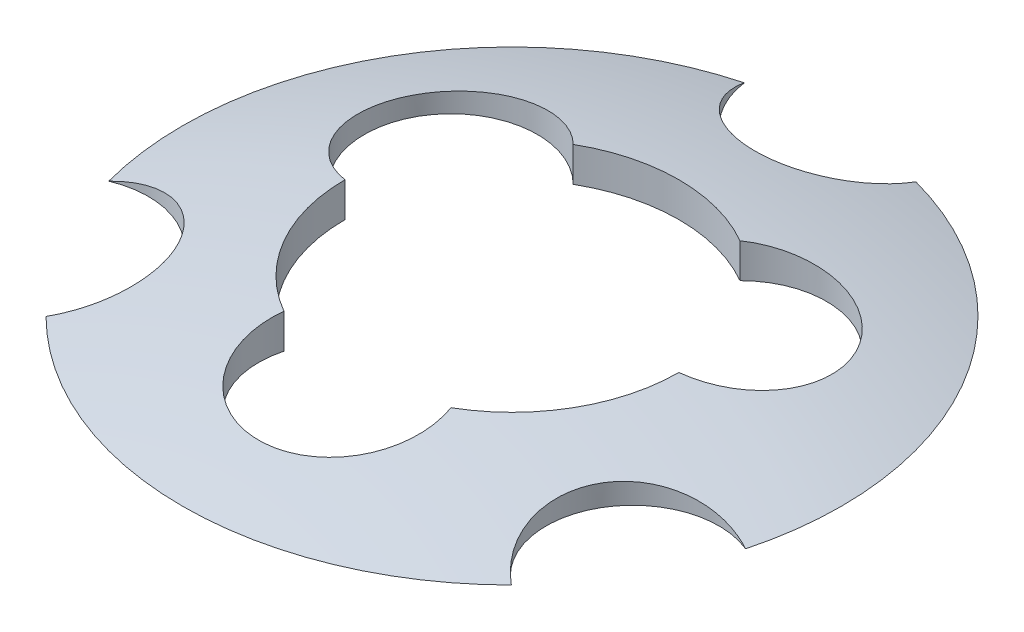
ISO-10303-21;
HEADER;
FILE_DESCRIPTION(('STEP AP214'),'2;1');
FILE_NAME('part.step','',(''),(''),'','','');
FILE_SCHEMA(('AUTOMOTIVE_DESIGN { 1 0 10303 214 1 1 1 1 }'));
ENDSEC;
DATA;
#1=APPLICATION_CONTEXT('core data for automotive mechanical design processes');
#2=APPLICATION_PROTOCOL_DEFINITION('international standard','automotive_design',2000,#1);
#3=PRODUCT_CONTEXT('',#1,'mechanical');
#4=PRODUCT('Part','Part','',(#3));
#5=PRODUCT_RELATED_PRODUCT_CATEGORY('part','',(#4));
#6=PRODUCT_DEFINITION_FORMATION('','',#4);
#7=PRODUCT_DEFINITION_CONTEXT('part definition',#1,'design');
#8=PRODUCT_DEFINITION('design','',#6,#7);
#9=PRODUCT_DEFINITION_SHAPE('','',#8);
#10=(LENGTH_UNIT() NAMED_UNIT(*) SI_UNIT(.MILLI.,.METRE.));
#11=(NAMED_UNIT(*) PLANE_ANGLE_UNIT() SI_UNIT($,.RADIAN.));
#12=(NAMED_UNIT(*) SI_UNIT($,.STERADIAN.) SOLID_ANGLE_UNIT());
#13=UNCERTAINTY_MEASURE_WITH_UNIT(LENGTH_MEASURE(1.E-05),#10,'distance_accuracy_value','');
#14=(GEOMETRIC_REPRESENTATION_CONTEXT(3) GLOBAL_UNCERTAINTY_ASSIGNED_CONTEXT((#13)) GLOBAL_UNIT_ASSIGNED_CONTEXT((#10,
#11,#12)) REPRESENTATION_CONTEXT('',''));
#15=CARTESIAN_POINT('',(0.,0.,0.));
#16=DIRECTION('',(0.,0.,1.));
#17=DIRECTION('',(1.,0.,0.));
#18=AXIS2_PLACEMENT_3D('',#15,#16,#17);
#19=CARTESIAN_POINT('',(0.,0.,0.));
#20=DIRECTION('',(0.,-1.,0.));
#21=DIRECTION('',(0.,0.,-1.));
#22=AXIS2_PLACEMENT_3D('',#19,#20,#21);
#23=PLANE('',#22);
#24=CARTESIAN_POINT('',(-8.24889197104678,0.,4.7625));
#25=DIRECTION('',(0.,-1.,0.));
#26=DIRECTION('',(0.,0.,-1.));
#27=AXIS2_PLACEMENT_3D('',#24,#25,#26);
#28=CIRCLE('',#27,2.5);
#29=CARTESIAN_POINT('',(-6.72557356011573,0.,6.74479690483503));
#30=VERTEX_POINT('',#29);
#31=CARTESIAN_POINT('',(-9.20395224301165,0.,2.45211910566367));
#32=VERTEX_POINT('',#31);
#33=EDGE_CURVE('E48',#30,#32,#28,.F.);
#34=ORIENTED_EDGE('',*,*,#33,.T.);
#35=CARTESIAN_POINT('',(0.,0.,0.));
#36=DIRECTION('',(0.,-1.,0.));
#37=DIRECTION('',(0.,0.,-1.));
#38=AXIS2_PLACEMENT_3D('',#35,#36,#37);
#39=CIRCLE('',#38,9.525);
#40=CARTESIAN_POINT('',(-2.47837868289592,0.,-9.19691601049869));
#41=VERTEX_POINT('',#40);
#42=EDGE_CURVE('E42',#32,#41,#39,.T.);
#43=ORIENTED_EDGE('',*,*,#42,.T.);
#44=CARTESIAN_POINT('',(0.,0.,-9.525));
#45=DIRECTION('',(0.,-1.,0.));
#46=DIRECTION('',(0.,0.,-1.));
#47=AXIS2_PLACEMENT_3D('',#44,#45,#46);
#48=CIRCLE('',#47,2.5);
#49=CARTESIAN_POINT('',(2.47837868289592,0.,-9.19691601049869));
#50=VERTEX_POINT('',#49);
#51=EDGE_CURVE('E194',#41,#50,#48,.F.);
#52=ORIENTED_EDGE('',*,*,#51,.T.);
#53=CARTESIAN_POINT('',(9.20395224301165,0.,2.45211910566366));
#54=VERTEX_POINT('',#53);
#55=EDGE_CURVE('E11',#50,#54,#39,.T.);
#56=ORIENTED_EDGE('',*,*,#55,.T.);
#57=CARTESIAN_POINT('',(8.24889197104678,0.,4.7625));
#58=DIRECTION('',(0.,-1.,0.));
#59=DIRECTION('',(0.,0.,-1.));
#60=AXIS2_PLACEMENT_3D('',#57,#58,#59);
#61=CIRCLE('',#60,2.5);
#62=CARTESIAN_POINT('',(6.72557356011574,0.,6.74479690483502));
#63=VERTEX_POINT('',#62);
#64=EDGE_CURVE('E55',#54,#63,#61,.F.);
#65=ORIENTED_EDGE('',*,*,#64,.T.);
#66=EDGE_CURVE('E41',#63,#30,#39,.T.);
#67=ORIENTED_EDGE('',*,*,#66,.T.);
#68=EDGE_LOOP('',(#34,#43,#52,#56,#65,#67));
#69=FACE_BOUND('',#68,.T.);
#70=CARTESIAN_POINT('',(-4.17857257325992,0.,-2.41249999999999));
#71=DIRECTION('',(0.,-1.,0.));
#72=DIRECTION('',(0.,0.,-1.));
#73=AXIS2_PLACEMENT_3D('',#70,#71,#72);
#74=CIRCLE('',#73,2.5);
#75=CARTESIAN_POINT('',(-2.41035121980581,0.,-4.17981243564596));
#76=VERTEX_POINT('',#75);
#77=CARTESIAN_POINT('',(-4.82499936222642,0.,0.00248082942836344));
#78=VERTEX_POINT('',#77);
#79=EDGE_CURVE('E148',#76,#78,#74,.F.);
#80=ORIENTED_EDGE('',*,*,#79,.T.);
#81=CARTESIAN_POINT('',(0.,0.,0.));
#82=DIRECTION('',(0.,-1.,0.));
#83=DIRECTION('',(0.,0.,-1.));
#84=AXIS2_PLACEMENT_3D('',#81,#82,#83);
#85=CIRCLE('',#84,4.825);
#86=CARTESIAN_POINT('',(-2.41464814242061,0.,4.17733160621763));
#87=VERTEX_POINT('',#86);
#88=EDGE_CURVE('E120',#78,#87,#85,.F.);
#89=ORIENTED_EDGE('',*,*,#88,.T.);
#90=CARTESIAN_POINT('',(0.,0.,4.825));
#91=DIRECTION('',(0.,-1.,0.));
#92=DIRECTION('',(0.,0.,-1.));
#93=AXIS2_PLACEMENT_3D('',#90,#91,#92);
#94=CIRCLE('',#93,2.5);
#95=CARTESIAN_POINT('',(2.41464814242063,0.,4.17733160621761));
#96=VERTEX_POINT('',#95);
#97=EDGE_CURVE('E159',#87,#96,#94,.F.);
#98=ORIENTED_EDGE('',*,*,#97,.T.);
#99=CARTESIAN_POINT('',(0.,0.,0.));
#100=DIRECTION('',(0.,-1.,0.));
#101=DIRECTION('',(0.,0.,-1.));
#102=AXIS2_PLACEMENT_3D('',#99,#100,#101);
#103=CIRCLE('',#102,4.825);
#104=CARTESIAN_POINT('',(4.82499936222642,0.,0.00248082942833784));
#105=VERTEX_POINT('',#104);
#106=EDGE_CURVE('E156',#96,#105,#103,.F.);
#107=ORIENTED_EDGE('',*,*,#106,.T.);
#108=CARTESIAN_POINT('',(4.17857257325991,0.,-2.41250000000001));
#109=DIRECTION('',(0.,-1.,0.));
#110=DIRECTION('',(0.,0.,-1.));
#111=AXIS2_PLACEMENT_3D('',#108,#109,#110);
#112=CIRCLE('',#111,2.5);
#113=CARTESIAN_POINT('',(2.41035121980579,0.,-4.17981243564598));
#114=VERTEX_POINT('',#113);
#115=EDGE_CURVE('E153',#105,#114,#112,.F.);
#116=ORIENTED_EDGE('',*,*,#115,.T.);
#117=CARTESIAN_POINT('',(0.,0.,0.));
#118=DIRECTION('',(0.,-1.,0.));
#119=DIRECTION('',(0.,0.,-1.));
#120=AXIS2_PLACEMENT_3D('',#117,#118,#119);
#121=CIRCLE('',#120,4.825);
#122=EDGE_CURVE('E150',#114,#76,#121,.F.);
#123=ORIENTED_EDGE('',*,*,#122,.T.);
#124=EDGE_LOOP('',(#80,#89,#98,#107,#116,#123));
#125=FACE_BOUND('',#124,.T.);
#126=ADVANCED_FACE('F34',(#69,#125),#23,.T.);
#127=CARTESIAN_POINT('',(0.,-33.2225,0.));
#128=DIRECTION('',(0.,-1.,0.));
#129=DIRECTION('',(1.,0.,0.));
#130=AXIS2_PLACEMENT_3D('',#127,#128,#129);
#131=SPHERICAL_SURFACE('',#130,34.5609625336159);
#132=CARTESIAN_POINT('',(-9.20460249034147,-0.000200000000170202,2.45238801065631));
#133=CARTESIAN_POINT('',(-9.1382596850941,0.0202068195616894,2.42494368167922));
#134=CARTESIAN_POINT('',(-9.07073258271183,0.0404794473597265,2.40035404084849));
#135=CARTESIAN_POINT('',(-8.93370316988775,0.0806377149228856,2.35704694884385));
#136=CARTESIAN_POINT('',(-8.86420070213767,0.100523323654084,2.33832996677634));
#137=CARTESIAN_POINT('',(-8.65336010003919,0.159410265325074,2.29124341577716));
#138=CARTESIAN_POINT('',(-8.50966636648488,0.197648602332286,2.27192897608878));
#139=CARTESIAN_POINT('',(-8.22018564104127,0.27093863785374,2.25845947821596));
#140=CARTESIAN_POINT('',(-8.07439653567314,0.305986812816329,2.2643319028089));
#141=CARTESIAN_POINT('',(-7.78516837005932,0.371790890557344,2.30156772565942));
#142=CARTESIAN_POINT('',(-7.64172785227154,0.402549552014638,2.33291465131219));
#143=CARTESIAN_POINT('',(-7.36504347145035,0.458105732186962,2.41957092218103));
#144=CARTESIAN_POINT('',(-7.23163606010825,0.483030598113739,2.47427573347614));
#145=CARTESIAN_POINT('',(-6.9754440011488,0.527042501908918,2.60632602485923));
#146=CARTESIAN_POINT('',(-6.85265927846137,0.546129581035118,2.6836713449308));
#147=CARTESIAN_POINT('',(-6.6262022656235,0.577187438878498,2.85558688505736));
#148=CARTESIAN_POINT('',(-6.52198056521516,0.589401329649163,2.94938983466315));
#149=CARTESIAN_POINT('',(-6.33044773771249,0.607385445233791,3.1534204760482));
#150=CARTESIAN_POINT('',(-6.24313227936429,0.613157322254068,3.26364394817331));
#151=CARTESIAN_POINT('',(-6.09029413314205,0.617991294143282,3.49402140778352));
#152=CARTESIAN_POINT('',(-6.02423589381622,0.617234402306646,3.61381679756323));
#153=CARTESIAN_POINT('',(-5.91257634851805,0.609468033011808,3.86239401019196));
#154=CARTESIAN_POINT('',(-5.86697404635307,0.602458860085877,3.99117539507502));
#155=CARTESIAN_POINT('',(-5.79758135332209,0.582477728810946,4.25323785787825));
#156=CARTESIAN_POINT('',(-5.77366832502264,0.56953992679933,4.38648916196221));
#157=CARTESIAN_POINT('',(-5.74760255452212,0.538123340810581,4.65444706259466));
#158=CARTESIAN_POINT('',(-5.74545100581019,0.519644252983747,4.78915373855615));
#159=CARTESIAN_POINT('',(-5.76277084323399,0.477329910685167,5.05876388598101));
#160=CARTESIAN_POINT('',(-5.78262652792321,0.453405446702152,5.19362844892341));
#161=CARTESIAN_POINT('',(-5.84363713428587,0.401095293619054,5.45755544609503));
#162=CARTESIAN_POINT('',(-5.88479703450312,0.372708562819989,5.58661651645101));
#163=CARTESIAN_POINT('',(-5.98868446261571,0.311236053232276,5.83992185407202));
#164=CARTESIAN_POINT('',(-6.05209676185343,0.278023461652938,5.96385384099055));
#165=CARTESIAN_POINT('',(-6.19807130772875,0.20859284570982,6.19890267040086));
#166=CARTESIAN_POINT('',(-6.28062607729265,0.172375998350551,6.31002449125282));
#167=CARTESIAN_POINT('',(-6.42518780841065,0.113154305761223,6.47443926904843));
#168=CARTESIAN_POINT('',(-6.48180194682068,0.0907996123087877,6.53280478549152));
#169=CARTESIAN_POINT('',(-6.60020073712788,0.0456184948474632,6.64355638959934));
#170=CARTESIAN_POINT('',(-6.66197463733372,0.0227931228906164,6.69595439864108));
#171=CARTESIAN_POINT('',(-6.72613156233501,-0.000199999999997771,6.74522558304471));
#172=B_SPLINE_CURVE_WITH_KNOTS('',3,(#132,#133,#134,#135,#136,#137,#138,#139,#140,#141,#142,
#143,#144,#145,#146,#147,#148,#149,#150,#151,#152,#153,#154,#155,#156,#157,#158,#159,#160,#161,
#162,#163,#164,#165,#166,#167,#168,#169,#170,#171),.UNSPECIFIED.,.F.,.F.,(4,2,2,2,2,2,2,2,2,2,2,
2,2,2,2,2,2,2,2,4),(0.,0.223784840918667,0.447587553161722,0.895118315647854,1.34313752780427,
1.7908672670992,2.22765153346368,2.66443271284087,3.08459659364863,3.5046526887422,
3.91310076974152,4.32152895738863,4.72763311033293,5.13375953558014,5.54709121596082,
5.96051953071728,6.38798354706996,6.81528087585197,7.06793159536838,7.32006839313107),.UNSPECIFIED.);
#173=EDGE_CURVE('E102',#32,#30,#172,.T.);
#174=ORIENTED_EDGE('',*,*,#173,.T.);
#175=ORIENTED_EDGE('',*,*,#66,.F.);
#176=CARTESIAN_POINT('',(6.72613156233502,-0.0002,6.74522558304471));
#177=CARTESIAN_POINT('',(6.66919267362737,0.0202068195618597,6.7014931928307));
#178=CARTESIAN_POINT('',(6.6141338688069,0.0404794473598956,6.65530782713905));
#179=CARTESIAN_POINT('',(6.50811412055484,0.0806377149230509,6.55829042057003));
#180=CARTESIAN_POINT('',(6.45715350472716,0.100523323654247,6.50745800890649));
#181=CARTESIAN_POINT('',(6.31095505433608,0.159410265325227,6.34840796683956));
#182=CARTESIAN_POINT('',(6.22238139212896,0.197648602332433,6.23362276306108));
#183=CARTESIAN_POINT('',(6.06597610207313,0.270938637853877,5.98965984985734));
#184=CARTESIAN_POINT('',(5.99816721826839,0.305986812816464,5.86046656871704));
#185=CARTESIAN_POINT('',(5.88580030398091,0.371790890557468,5.59136971838022));
#186=CARTESIAN_POINT('',(5.84122727903289,0.402549552014755,5.45147312321762));
#187=CARTESIAN_POINT('',(5.777931620592,0.458105732187067,5.16852928516167));
#188=CARTESIAN_POINT('',(5.75860367121178,0.483030598113838,5.02564267223873));
#189=CARTESIAN_POINT('',(5.74486654864701,0.527042501908999,4.73774869524046));
#190=CARTESIAN_POINT('',(5.75045719934915,0.546129581035186,4.59274134616074));
#191=CARTESIAN_POINT('',(5.78611191798519,0.577187438878543,4.31066605011474));
#192=CARTESIAN_POINT('',(5.81523680508958,0.589401329649199,4.17350593513262));
#193=CARTESIAN_POINT('',(5.89616610992819,0.607385445233818,3.90561832016414));
#194=CARTESIAN_POINT('',(5.94796470770779,0.613157322254094,3.77488917902898));
#195=CARTESIAN_POINT('',(6.07105836707848,0.617991294143295,3.52733873192812));
#196=CARTESIAN_POINT('',(6.14177509822108,0.617234402306646,3.41023292365284));
#197=CARTESIAN_POINT('',(6.30121950651044,0.609468033011785,3.18924431453529));
#198=CARTESIAN_POINT('',(6.38994630627124,0.602458860085843,3.08536086994784));
#199=CARTESIAN_POINT('',(6.58220270992171,0.582477728810895,2.89423380354443));
#200=CARTESIAN_POINT('',(6.68564521019612,0.569539926799274,2.80689886151373));
#201=CARTESIAN_POINT('',(6.90467067403834,0.538123340810513,2.65034629177488));
#202=CARTESIAN_POINT('',(7.02025430312439,0.519644252983673,2.58112965795215));
#203=CARTESIAN_POINT('',(7.26240345862431,0.477329910685084,2.4613240034382));
#204=CARTESIAN_POINT('',(7.38912743854734,0.453405446702067,2.41108724931742));
#205=CARTESIAN_POINT('',(7.64820022602386,0.401095293618952,2.33196048574202));
#206=CARTESIAN_POINT('',(7.78055034170038,0.372708562819873,2.30307546976943));
#207=CARTESIAN_POINT('',(8.05186291305067,0.311236053232148,2.26639195283832));
#208=CARTESIAN_POINT('',(8.19089731168246,0.278023461652813,2.25934262143133));
#209=CARTESIAN_POINT('',(8.46744284201925,0.20859284570969,2.26823587176015));
#210=CARTESIAN_POINT('',(8.60495454657378,0.172375998350413,2.28416948898011));
#211=CARTESIAN_POINT('',(8.81962278646135,0.113154305761077,2.3271562316456));
#212=CARTESIAN_POINT('',(8.89847587561109,0.0907996123086375,2.34700275550053));
#213=CARTESIAN_POINT('',(9.05358897343194,0.0456184948473052,2.39416331363004));
#214=CARTESIAN_POINT('',(9.12985393047274,0.022793122890454,2.42146207597829));
#215=CARTESIAN_POINT('',(9.20460249034147,-0.000200000000167363,2.4523880106563));
#216=B_SPLINE_CURVE_WITH_KNOTS('',3,(#176,#177,#178,#179,#180,#181,#182,#183,#184,#185,#186,
#187,#188,#189,#190,#191,#192,#193,#194,#195,#196,#197,#198,#199,#200,#201,#202,#203,#204,#205,
#206,#207,#208,#209,#210,#211,#212,#213,#214,#215),.UNSPECIFIED.,.F.,.F.,(4,2,2,2,2,2,2,2,2,2,2,
2,2,2,2,2,2,2,2,4),(0.,0.223784840918663,0.447587553161714,0.895118315647837,1.34313752780424,
1.79086726709917,2.22765153346364,2.66443271284081,3.08459659364856,3.50465268874213,
3.91310076974144,4.32152895738855,4.72763311033285,5.13375953558005,5.54709121596075,
5.96051953071721,6.3879835470699,6.81528087585192,7.06793159536836,7.32006839313108),.UNSPECIFIED.);
#217=EDGE_CURVE('E113',#63,#54,#216,.T.);
#218=ORIENTED_EDGE('',*,*,#217,.T.);
#219=ORIENTED_EDGE('',*,*,#55,.F.);
#220=CARTESIAN_POINT('',(2.47847092800592,-0.000200000000015778,-9.19761359370085));
#221=CARTESIAN_POINT('',(2.4690670114662,0.0202068195618505,-9.12643687450976));
#222=CARTESIAN_POINT('',(2.4565987139044,0.0404794473598871,-9.0556618679874));
#223=CARTESIAN_POINT('',(2.42558904933238,0.0806377149230395,-8.91533736941378));
#224=CARTESIAN_POINT('',(2.40704719740996,0.100523323654232,-8.84578797568274));
#225=CARTESIAN_POINT('',(2.34240504570256,0.159410265325207,-8.63965138261667));
#226=CARTESIAN_POINT('',(2.28728497435538,0.197648602332417,-8.50555173914984));
#227=CARTESIAN_POINT('',(2.15420953896761,0.270938637853865,-8.24811932807334));
#228=CARTESIAN_POINT('',(2.07622931740421,0.305986812816452,-8.12479847152602));
#229=CARTESIAN_POINT('',(1.89936806607789,0.371790890557462,-7.89293744403978));
#230=CARTESIAN_POINT('',(1.80050057323815,0.402549552014753,-7.78438777452998));
#231=CARTESIAN_POINT('',(1.58711185085788,0.458105732187062,-7.58810020734293));
#232=CARTESIAN_POINT('',(1.47303238889601,0.483030598113825,-7.49991840571512));
#233=CARTESIAN_POINT('',(1.23057745250135,0.527042501908986,-7.34407472009999));
#234=CARTESIAN_POINT('',(1.10220207911181,0.546129581035182,-7.27641269109186));
#235=CARTESIAN_POINT('',(0.840090347637937,0.577187438878548,-7.16625293517246));
#236=CARTESIAN_POINT('',(0.706743760125236,0.589401329649203,-7.12289576979615));
#237=CARTESIAN_POINT('',(0.434281627784,0.607385445233815,-7.05903879621277));
#238=CARTESIAN_POINT('',(0.295167571656229,0.613157322254085,-7.03853312720272));
#239=CARTESIAN_POINT('',(0.019235766063349,0.617991294143285,-7.02136013971209));
#240=CARTESIAN_POINT('',(-0.117539204405056,0.61723440230664,-7.02404972121654));
#241=CARTESIAN_POINT('',(-0.38864315799253,0.609468033011788,-7.05163832472772));
#242=CARTESIAN_POINT('',(-0.522972259918296,0.602458860085852,-7.07653626502335));
#243=CARTESIAN_POINT('',(-0.784621356599676,0.582477728810903,-7.14747166142317));
#244=CARTESIAN_POINT('',(-0.911976885173508,0.569539926799275,-7.19338802347644));
#245=CARTESIAN_POINT('',(-1.1570681195162,0.538123340810513,-7.30479335437005));
#246=CARTESIAN_POINT('',(-1.27480329731416,0.519644252983677,-7.3702833965088));
#247=CARTESIAN_POINT('',(-1.49963261539022,0.477329910685089,-7.5200878894197));
#248=CARTESIAN_POINT('',(-1.606500910624,0.453405446702068,-7.60471569824132));
#249=CARTESIAN_POINT('',(-1.8045630917378,0.401095293618957,-7.78951593183753));
#250=CARTESIAN_POINT('',(-1.89575330719705,0.372708562819885,-7.88969198622091));
#251=CARTESIAN_POINT('',(-2.0631784504347,0.311236053232166,-8.10631380691078));
#252=CARTESIAN_POINT('',(-2.13880054982875,0.278023461652828,-8.2231964624223));
#253=CARTESIAN_POINT('',(-2.26937153429017,0.208592845709701,-8.46713854216141));
#254=CARTESIAN_POINT('',(-2.32432846928077,0.172375998350424,-8.59419398023331));
#255=CARTESIAN_POINT('',(-2.39443497805028,0.113154305761109,-8.80159550069431));
#256=CARTESIAN_POINT('',(-2.41667392878995,0.0907996123086928,-8.87980754099224));
#257=CARTESIAN_POINT('',(-2.45338823630355,0.0456184948474086,-9.03771970322939));
#258=CARTESIAN_POINT('',(-2.46787929313848,0.0227931228905826,-9.1174164746193));
#259=CARTESIAN_POINT('',(-2.47847092800592,-0.000200000000012453,-9.19761359370085));
#260=B_SPLINE_CURVE_WITH_KNOTS('',3,(#220,#221,#222,#223,#224,#225,#226,#227,#228,#229,#230,
#231,#232,#233,#234,#235,#236,#237,#238,#239,#240,#241,#242,#243,#244,#245,#246,#247,#248,#249,
#250,#251,#252,#253,#254,#255,#256,#257,#258,#259),.UNSPECIFIED.,.F.,.F.,(4,2,2,2,2,2,2,2,2,2,2,
2,2,2,2,2,2,2,2,4),(0.,0.223784840918663,0.447587553161714,0.89511831564784,1.34313752780424,
1.79086726709917,2.22765153346365,2.66443271284082,3.08459659364857,3.50465268874214,
3.91310076974145,4.32152895738856,4.72763311033286,5.13375953558006,5.54709121596076,
5.96051953071721,6.3879835470699,6.81528087585192,7.06793159536812,7.32006839313058),.UNSPECIFIED.);
#261=EDGE_CURVE('E119',#50,#41,#260,.T.);
#262=ORIENTED_EDGE('',*,*,#261,.T.);
#263=ORIENTED_EDGE('',*,*,#42,.F.);
#264=EDGE_LOOP('',(#174,#175,#218,#219,#262,#263));
#265=FACE_BOUND('',#264,.T.);
#266=CARTESIAN_POINT('',(-4.8242517204857,1.0001053859221,0.00268082942827294));
#267=CARTESIAN_POINT('',(-4.8928773338026,0.990432853362324,-0.0156664806650618));
#268=CARTESIAN_POINT('',(-4.96067275449976,0.980652235170716,-0.0369261224914135));
#269=CARTESIAN_POINT('',(-5.09418761018969,0.960935722446493,-0.0851212903139013));
#270=CARTESIAN_POINT('',(-5.15990715833109,0.950999836421269,-0.112056506338096));
#271=CARTESIAN_POINT('',(-5.35314746622918,0.921078782668521,-0.20106727242441));
#272=CARTESIAN_POINT('',(-5.47695703099913,0.900951007678126,-0.271403571772316));
#273=CARTESIAN_POINT('',(-5.71088634912141,0.860924298575132,-0.432049687255653));
#274=CARTESIAN_POINT('',(-5.82100015908319,0.841025467190311,-0.522368127896638));
#275=CARTESIAN_POINT('',(-6.02439441488904,0.802024779254184,-0.720437581195636));
#276=CARTESIAN_POINT('',(-6.11767826651021,0.782922762059262,-0.828185058455712));
#277=CARTESIAN_POINT('',(-6.28461936673321,0.746086342444151,-1.05798160658342));
#278=CARTESIAN_POINT('',(-6.35829581076621,0.728350614621585,-1.18001652037844));
#279=CARTESIAN_POINT('',(-6.48395698940387,0.694745712585843,-1.435049241979));
#280=CARTESIAN_POINT('',(-6.53593919651225,0.678876756016222,-1.56804832500933));
#281=CARTESIAN_POINT('',(-6.61629830671072,0.649589949981099,-1.84023354259053));
#282=CARTESIAN_POINT('',(-6.64483757710595,0.636155751786789,-1.97936996432974));
#283=CARTESIAN_POINT('',(-6.67797423684435,0.612013030322229,-2.26069025344484));
#284=CARTESIAN_POINT('',(-6.6825743403784,0.60130419818455,-2.40287377350923));
#285=CARTESIAN_POINT('',(-6.66766760912562,0.583033824434805,-2.68477847477467));
#286=CARTESIAN_POINT('',(-6.64839543668278,0.575442607775563,-2.82451014672175));
#287=CARTESIAN_POINT('',(-6.58661110729689,0.563494365180506,-3.09888331071539));
#288=CARTESIAN_POINT('',(-6.54409972527871,0.55913723141375,-3.23352497233124));
#289=CARTESIAN_POINT('',(-6.43746041827795,0.553816092111505,-3.4927344099705));
#290=CARTESIAN_POINT('',(-6.37351239519323,0.552824587490668,-3.6173756637278));
#291=CARTESIAN_POINT('',(-6.22573797906052,0.554188429101915,-3.85423409913697));
#292=CARTESIAN_POINT('',(-6.14191209792991,0.556543689152076,-3.96645160063039));
#293=CARTESIAN_POINT('',(-5.95706466186898,0.564516078929104,-4.17497664864036));
#294=CARTESIAN_POINT('',(-5.85609318851875,0.570123820365238,-4.27132896654155));
#295=CARTESIAN_POINT('',(-5.63968776230503,0.584421606151287,-4.44583820457768));
#296=CARTESIAN_POINT('',(-5.52425385651462,0.593111640468962,-4.52399518393339));
#297=CARTESIAN_POINT('',(-5.28176969044388,0.61334858594583,-4.66024727770099));
#298=CARTESIAN_POINT('',(-5.15467843605671,0.624905843234039,-4.71826787168612));
#299=CARTESIAN_POINT('',(-4.89284087485765,0.650516612942092,-4.81232828446422));
#300=CARTESIAN_POINT('',(-4.75809395580307,0.66457032520136,-4.84836634254626));
#301=CARTESIAN_POINT('',(-4.48354653562084,0.694893116032049,-4.89777878672412));
#302=CARTESIAN_POINT('',(-4.34371267888615,0.711180107055804,-4.9109567824358));
#303=CARTESIAN_POINT('',(-4.06401874921896,0.745402942812946,-4.91378731382211));
#304=CARTESIAN_POINT('',(-3.92415867668109,0.76333876444905,-4.9034401789952));
#305=CARTESIAN_POINT('',(-3.64693333152973,0.800530713769457,-4.85938548531417));
#306=CARTESIAN_POINT('',(-3.50960538067559,0.819797953887091,-4.82545246951674));
#307=CARTESIAN_POINT('',(-3.2426992626673,0.858947555900739,-4.73499755761469));
#308=CARTESIAN_POINT('',(-3.11312072505698,0.878829888323572,-4.67847674230053));
#309=CARTESIAN_POINT('',(-2.88293060834081,0.915822261769426,-4.55397555811593));
#310=CARTESIAN_POINT('',(-2.78081815898463,0.932925201705403,-4.48876078275732));
#311=CARTESIAN_POINT('',(-2.63557108918684,0.958332911840539,-4.38044344913213));
#312=CARTESIAN_POINT('',(-2.58847423900531,0.96676130678896,-4.34258704955833));
#313=CARTESIAN_POINT('',(-2.49712501603286,0.983499003076028,-4.26354868982525));
#314=CARTESIAN_POINT('',(-2.45287303260158,0.991808287992397,-4.22236627618756));
#315=CARTESIAN_POINT('',(-2.41015121980799,1.00003852776804,-4.17961231014195));
#316=B_SPLINE_CURVE_WITH_KNOTS('',3,(#266,#267,#268,#269,#270,#271,#272,#273,#274,#275,#276,
#277,#278,#279,#280,#281,#282,#283,#284,#285,#286,#287,#288,#289,#290,#291,#292,#293,#294,#295,
#296,#297,#298,#299,#300,#301,#302,#303,#304,#305,#306,#307,#308,#309,#310,#311,#312,#313,#314,
#315),.UNSPECIFIED.,.F.,.F.,(4,2,2,2,2,2,2,2,2,2,2,2,2,2,2,2,2,2,2,2,2,2,2,2,4),(0.,
0.214941280466066,0.429870824938066,0.859088789849481,1.28849237248446,1.71780896160218,
2.14670369547635,2.57564838397362,3.00159650985284,3.42749634124824,3.84924263863009,
4.27097487349572,4.68925291508825,5.10752018587481,5.52458609422869,5.94165064512978,
6.36024260310489,6.77886808417753,7.20107248073813,7.62327096384202,8.04956175322972,
8.47583214771954,8.84159304718846,9.02448560341888,9.20740313798599),.UNSPECIFIED.);
#317=CARTESIAN_POINT('',(-4.82499936222642,1.,0.00248082942836629));
#318=VERTEX_POINT('',#317);
#319=CARTESIAN_POINT('',(-2.41035121980581,1.,-4.17981243564596));
#320=VERTEX_POINT('',#319);
#321=EDGE_CURVE('E161',#318,#320,#316,.T.);
#322=ORIENTED_EDGE('',*,*,#321,.T.);
#323=CARTESIAN_POINT('',(0.,1.,0.));
#324=DIRECTION('',(0.,1.,0.));
#325=DIRECTION('',(0.,0.,1.));
#326=AXIS2_PLACEMENT_3D('',#323,#324,#325);
#327=CIRCLE('',#326,4.825);
#328=CARTESIAN_POINT('',(2.41035121980579,1.,-4.17981243564598));
#329=VERTEX_POINT('',#328);
#330=EDGE_CURVE('E131',#329,#320,#327,.T.);
#331=ORIENTED_EDGE('',*,*,#330,.F.);
#332=CARTESIAN_POINT('',(2.41015121980797,1.00003852776804,-4.17961231014196));
#333=CARTESIAN_POINT('',(2.46036308606193,0.990365475354952,-4.2298602720998));
#334=CARTESIAN_POINT('',(2.51268158529509,0.980584416776665,-4.27793269797852));
#335=CARTESIAN_POINT('',(2.62119515312902,0.960867184300394,-4.36944101069756));
#336=CARTESIAN_POINT('',(2.67739000998464,0.950931018897988,-4.4128771504643));
#337=CARTESIAN_POINT('',(2.85111982362143,0.921009369818963,-4.53568865835385));
#338=CARTESIAN_POINT('',(2.97395178699612,0.900881522995938,-4.60771864442794));
#339=CARTESIAN_POINT('',(3.23006420105735,0.860855327133648,-4.72993410696959));
#340=CARTESIAN_POINT('',(3.36334914824118,0.840957081129223,-4.78011012114763));
#341=CARTESIAN_POINT('',(3.63659492632926,0.801958214710771,-4.85716639379157));
#342=CARTESIAN_POINT('',(3.7765543989183,0.78285743347816,-4.88405137099103));
#343=CARTESIAN_POINT('',(4.05904051717486,0.746024160895082,-4.91367276862829));
#344=CARTESIAN_POINT('',(4.20156449724854,0.728290339779347,-4.91643295893971));
#345=CARTESIAN_POINT('',(4.4852560191186,0.694689822118747,-4.89768661770432));
#346=CARTESIAN_POINT('',(4.62642340100222,0.678823343271732,-4.87617725986199));
#347=CARTESIAN_POINT('',(4.90230866718466,0.649542020499116,-4.80962360642767));
#348=CARTESIAN_POINT('',(5.03706472985468,0.636110817954064,-4.76474483817389));
#349=CARTESIAN_POINT('',(5.297240757987,0.611974489980531,-4.65273128975146));
#350=CARTESIAN_POINT('',(5.42266178033794,0.601269055614508,-4.58559903377185));
#351=CARTESIAN_POINT('',(5.65931407615208,0.583005747225454,-4.43169144872528));
#352=CARTESIAN_POINT('',(5.77067180932068,0.575418194044121,-4.34511407934699));
#353=CARTESIAN_POINT('',(5.97735572592984,0.563477458634851,-4.15438134532911));
#354=CARTESIAN_POINT('',(6.07268244363976,0.559124168601345,-4.05022656672778));
#355=CARTESIAN_POINT('',(6.24380104229072,0.553810738364143,-3.82823723966929));
#356=CARTESIAN_POINT('',(6.31974648940407,0.552823105808955,-3.7105216891462));
#357=CARTESIAN_POINT('',(6.45093661807157,0.554194643299603,-3.4640916124974));
#358=CARTESIAN_POINT('',(6.50618183222344,0.556553727230065,-3.33537736946248));
#359=CARTESIAN_POINT('',(6.59429499027895,0.564533602717873,-3.07101592947065));
#360=CARTESIAN_POINT('',(6.62722666947656,0.570145018556479,-2.9353896790228));
#361=CARTESIAN_POINT('',(6.67010049257586,0.584449901856992,-2.66071449902671));
#362=CARTESIAN_POINT('',(6.6800427108329,0.593143359350473,-2.52166558054995));
#363=CARTESIAN_POINT('',(6.67674494297613,0.613386849748577,-2.24354262021146));
#364=CARTESIAN_POINT('',(6.66341984113523,0.624947237559703,-2.10447035483836));
#365=CARTESIAN_POINT('',(6.61390695776778,0.650563849326802,-1.83069117218951));
#366=CARTESIAN_POINT('',(6.57771734509565,0.66462027311749,-1.69598460545709));
#367=CARTESIAN_POINT('',(6.48318517809805,0.69494804558368,-1.43353082059772));
#368=CARTESIAN_POINT('',(6.42465583920508,0.711237306367365,-1.30585296195264));
#369=CARTESIAN_POINT('',(6.28721249380128,0.745464131892712,-1.06224126675144));
#370=CARTESIAN_POINT('',(6.20829877265658,0.763401673557406,-0.946307265821712));
#371=CARTESIAN_POINT('',(6.03149054570489,0.800596472646969,-0.728283861984254));
#372=CARTESIAN_POINT('',(5.93341948697508,0.819864836014094,-0.626339534768358));
#373=CARTESIAN_POINT('',(5.72159302880103,0.859016050441516,-0.440459989619536));
#374=CARTESIAN_POINT('',(5.6078383806926,0.878898872030283,-0.356523909478136));
#375=CARTESIAN_POINT('',(5.38489452414154,0.915891501601603,-0.219467151764094));
#376=CARTESIAN_POINT('',(5.27734948432191,0.932994293675278,-0.163663498271608));
#377=CARTESIAN_POINT('',(5.11090593985154,0.958401428856545,-0.0920669561702389));
#378=CARTESIAN_POINT('',(5.05456847533381,0.96682957368064,-0.0702190750545391));
#379=CARTESIAN_POINT('',(4.9404365510884,0.983566652939049,-0.0306497864692508));
#380=CARTESIAN_POINT('',(4.88264189340364,0.991875570933411,-0.0129289430342382));
#381=CARTESIAN_POINT('',(4.8242517204857,1.0001053859221,0.00268082942824726));
#382=B_SPLINE_CURVE_WITH_KNOTS('',3,(#332,#333,#334,#335,#336,#337,#338,#339,#340,#341,#342,
#343,#344,#345,#346,#347,#348,#349,#350,#351,#352,#353,#354,#355,#356,#357,#358,#359,#360,#361,
#362,#363,#364,#365,#366,#367,#368,#369,#370,#371,#372,#373,#374,#375,#376,#377,#378,#379,#380,
#381),.UNSPECIFIED.,.F.,.F.,(4,2,2,2,2,2,2,2,2,2,2,2,2,2,2,2,2,2,2,2,2,2,2,2,4),(0.,
0.214941295232366,0.429870858628663,0.859088924429414,1.28849264791886,1.71780935441802,
2.14670301238675,2.57564662206157,3.00159250663933,3.42749009315898,3.84923399993659,
4.27096384837066,4.68924043317853,5.10750625538023,5.52457226940509,5.94163693450155,
6.36023048955673,6.77885757268182,7.20106435414152,7.62326522534195,8.04955816192257,
8.47583068366521,8.8415922976943,9.02448522890026,9.20740314109447),.UNSPECIFIED.);
#383=CARTESIAN_POINT('',(4.82499936222642,1.,0.00248082942833896));
#384=VERTEX_POINT('',#383);
#385=EDGE_CURVE('E169',#329,#384,#382,.T.);
#386=ORIENTED_EDGE('',*,*,#385,.T.);
#387=CARTESIAN_POINT('',(0.,1.,0.));
#388=DIRECTION('',(0.,1.,0.));
#389=DIRECTION('',(0.,0.,1.));
#390=AXIS2_PLACEMENT_3D('',#387,#388,#389);
#391=CIRCLE('',#390,4.825);
#392=CARTESIAN_POINT('',(2.41464814242063,1.,4.17733160621761));
#393=VERTEX_POINT('',#392);
#394=EDGE_CURVE('E142',#393,#384,#391,.T.);
#395=ORIENTED_EDGE('',*,*,#394,.F.);
#396=CARTESIAN_POINT('',(2.4145944885918,1.00002819781145,4.17713160621762));
#397=CARTESIAN_POINT('',(2.43300248248264,0.990355065114832,4.24574088767101));
#398=CARTESIAN_POINT('',(2.44847306930508,0.980573938531026,4.31508671095158));
#399=CARTESIAN_POINT('',(2.47346056794606,0.960856594922161,4.45481711822278));
#400=CARTESIAN_POINT('',(2.48297780466171,0.950920386390855,4.52520164531275));
#401=CARTESIAN_POINT('',(2.50246435774047,0.920998645440159,4.73706241563413));
#402=CARTESIAN_POINT('',(2.50342385642119,0.900870787591113,4.87945304216853));
#403=CARTESIAN_POINT('',(2.48120076167842,0.860844671168682,5.16235998003741));
#404=CARTESIAN_POINT('',(2.45800772509939,0.84094651567759,5.30287545396966));
#405=CARTESIAN_POINT('',(2.38810915987876,0.801947930825064,5.57803930468181));
#406=CARTESIAN_POINT('',(2.34140839710187,0.78284734061804,5.7126888646845));
#407=CARTESIAN_POINT('',(2.22581032966746,0.746014554385005,5.97213621710309));
#408=CARTESIAN_POINT('',(2.15693495239123,0.728281027919401,6.09694359081684));
#409=CARTESIAN_POINT('',(1.99884722440324,0.69468118776782,6.33324965760567));
#410=CARTESIAN_POINT('',(1.9096325060736,0.678815091787917,6.4447467989881));
#411=CARTESIAN_POINT('',(1.71404653451276,0.649534616285858,6.65038762330604));
#412=CARTESIAN_POINT('',(1.60779954690996,0.636103876616107,6.74464714405758));
#413=CARTESIAN_POINT('',(1.38069994852577,0.611968536519216,6.91395245762883));
#414=CARTESIAN_POINT('',(1.25984899526198,0.60126362714412,6.98900042790739));
#415=CARTESIAN_POINT('',(1.00823125743252,0.583001410411755,7.11698586639273));
#416=CARTESIAN_POINT('',(0.877572675315546,0.575414423261083,7.17013183612352));
#417=CARTESIAN_POINT('',(0.609048998719983,0.563474847745484,7.25375086022097));
#418=CARTESIAN_POINT('',(0.471184144595481,0.559122151579353,7.28422467026678));
#419=CARTESIAN_POINT('',(0.193375509311796,0.553809912399136,7.32141472028547));
#420=CARTESIAN_POINT('',(0.0534579933111192,0.552822878079289,7.32832344408537));
#421=CARTESIAN_POINT('',(-0.225551334999081,0.554195604583132,7.31871406646077));
#422=CARTESIAN_POINT('',(-0.36464316846205,0.55655527929149,7.30219656782453));
#423=CARTESIAN_POINT('',(-0.63764170580919,0.564536311245393,7.24631598039206));
#424=CARTESIAN_POINT('',(-0.771562136406002,0.570148294687842,7.20701854782916));
#425=CARTESIAN_POINT('',(-1.03087171030135,0.584454274450562,7.10680308557844));
#426=CARTESIAN_POINT('',(-1.15626088099785,0.593148260872492,7.04588512532837));
#427=CARTESIAN_POINT('',(-1.395469351001,0.613392762965094,6.90396057924481));
#428=CARTESIAN_POINT('',(-1.50924454472205,0.624953635005403,6.82288115894421));
#429=CARTESIAN_POINT('',(-1.72158254384267,0.650571149586203,6.6431057807904));
#430=CARTESIAN_POINT('',(-1.82014413146747,0.664627991723439,6.54440841406889));
#431=CARTESIAN_POINT('',(-2.00016340051771,0.694956529778932,6.33130883334255));
#432=CARTESIAN_POINT('',(-2.08146761639207,0.711246137424299,6.21677954146483));
#433=CARTESIAN_POINT('',(-2.22371275508854,0.745473579380422,5.97593986282856));
#434=CARTESIAN_POINT('',(-2.28465395479947,0.763411391275273,5.84962963629271));
#435=CARTESIAN_POINT('',(-2.38505589630994,0.800606645267928,5.58749423581383));
#436=CARTESIAN_POINT('',(-2.42430270962251,0.81987519289559,5.45158870313691));
#437=CARTESIAN_POINT('',(-2.47935755689462,0.859026668394265,5.17519990791897));
#438=CARTESIAN_POINT('',(-2.49516674836363,0.878909565874985,5.03471687179648));
#439=CARTESIAN_POINT('',(-2.50237864557514,0.915887112336669,4.77322003301964));
#440=CARTESIAN_POINT('',(-2.496942432779,0.932974733702926,4.65228887812234));
#441=CARTESIAN_POINT('',(-2.47576143456335,0.958359698937599,4.47250346488439));
#442=CARTESIAN_POINT('',(-2.46652951754714,0.96678052446952,4.41284178607279));
#443=CARTESIAN_POINT('',(-2.44377106651238,0.983503277109274,4.29431773224298));
#444=CARTESIAN_POINT('',(-2.43024394445559,0.991805187774236,4.23545546782048));
#445=CARTESIAN_POINT('',(-2.41459448859177,1.00002819781145,4.17713160621761));
#446=B_SPLINE_CURVE_WITH_KNOTS('',3,(#396,#397,#398,#399,#400,#401,#402,#403,#404,#405,#406,
#407,#408,#409,#410,#411,#412,#413,#414,#415,#416,#417,#418,#419,#420,#421,#422,#423,#424,#425,
#426,#427,#428,#429,#430,#431,#432,#433,#434,#435,#436,#437,#438,#439,#440,#441,#442,#443,#444,
#445),.UNSPECIFIED.,.F.,.F.,(4,2,2,2,2,2,2,2,2,2,2,2,2,2,2,2,2,2,2,2,2,2,2,2,4),(0.,
0.214941297477591,0.429870863761532,0.859088945055842,1.28849269021527,1.71780941477578,
2.1467029064577,2.57564634935716,3.00159188758409,3.427489127266,3.84923266468802,
4.27096214446951,4.68923850491355,5.10750410273856,5.52457012909937,5.9416348159986,
6.36022863776855,6.77885594857079,7.20106301425617,7.62326433869118,8.0495579250045,
8.47583045733446,8.84126954754923,9.02400002725128,9.20675553459967),.UNSPECIFIED.);
#447=CARTESIAN_POINT('',(-2.41464814242061,1.,4.17733160621762));
#448=VERTEX_POINT('',#447);
#449=EDGE_CURVE('E187',#393,#448,#446,.T.);
#450=ORIENTED_EDGE('',*,*,#449,.T.);
#451=CARTESIAN_POINT('',(0.,1.,0.));
#452=DIRECTION('',(0.,1.,0.));
#453=DIRECTION('',(0.,0.,1.));
#454=AXIS2_PLACEMENT_3D('',#451,#452,#453);
#455=CIRCLE('',#454,4.825);
#456=EDGE_CURVE('E145',#318,#448,#455,.T.);
#457=ORIENTED_EDGE('',*,*,#456,.F.);
#458=EDGE_LOOP('',(#322,#331,#386,#395,#450,#457));
#459=FACE_BOUND('',#458,.T.);
#460=ADVANCED_FACE('F116',(#265,#459),#131,.T.);
#461=CARTESIAN_POINT('',(-4.17857257325992,-0.000999999999999916,-2.41249999999999));
#462=DIRECTION('',(0.,1.,0.));
#463=DIRECTION('',(0.,0.,1.));
#464=AXIS2_PLACEMENT_3D('',#461,#462,#463);
#465=CYLINDRICAL_SURFACE('',#464,2.5);
#466=DIRECTION('',(0.,1.,0.));
#467=VECTOR('',#466,1.);
#468=CARTESIAN_POINT('',(-2.41035121980581,-0.000999999999999916,-4.17981243564596));
#469=LINE('',#468,#467);
#470=EDGE_CURVE('E122',#76,#320,#469,.T.);
#471=ORIENTED_EDGE('',*,*,#470,.T.);
#472=ORIENTED_EDGE('',*,*,#321,.F.);
#473=DIRECTION('',(0.,1.,0.));
#474=VECTOR('',#473,1.);
#475=CARTESIAN_POINT('',(-4.82499936222642,-0.000999999999999916,0.00248082942836344));
#476=LINE('',#475,#474);
#477=EDGE_CURVE('E128',#78,#318,#476,.T.);
#478=ORIENTED_EDGE('',*,*,#477,.F.);
#479=ORIENTED_EDGE('',*,*,#79,.F.);
#480=EDGE_LOOP('',(#471,#472,#478,#479));
#481=FACE_BOUND('',#480,.T.);
#482=ADVANCED_FACE('F175',(#481),#465,.F.);
#483=CARTESIAN_POINT('',(0.,-0.000999999999999916,0.));
#484=DIRECTION('',(0.,1.,0.));
#485=DIRECTION('',(0.,0.,1.));
#486=AXIS2_PLACEMENT_3D('',#483,#484,#485);
#487=CYLINDRICAL_SURFACE('',#486,4.825);
#488=DIRECTION('',(0.,1.,0.));
#489=VECTOR('',#488,1.);
#490=CARTESIAN_POINT('',(2.41035121980579,-0.000999999999999916,-4.17981243564598));
#491=LINE('',#490,#489);
#492=EDGE_CURVE('E125',#114,#329,#491,.T.);
#493=ORIENTED_EDGE('',*,*,#492,.T.);
#494=ORIENTED_EDGE('',*,*,#330,.T.);
#495=ORIENTED_EDGE('',*,*,#470,.F.);
#496=ORIENTED_EDGE('',*,*,#122,.F.);
#497=EDGE_LOOP('',(#493,#494,#495,#496));
#498=FACE_BOUND('',#497,.T.);
#499=ADVANCED_FACE('F184',(#498),#487,.F.);
#500=CARTESIAN_POINT('',(4.17857257325991,-0.000999999999999916,-2.41250000000001));
#501=DIRECTION('',(0.,1.,0.));
#502=DIRECTION('',(0.,0.,1.));
#503=AXIS2_PLACEMENT_3D('',#500,#501,#502);
#504=CYLINDRICAL_SURFACE('',#503,2.5);
#505=DIRECTION('',(0.,1.,0.));
#506=VECTOR('',#505,1.);
#507=CARTESIAN_POINT('',(4.82499936222642,-0.000999999999999916,0.00248082942833784));
#508=LINE('',#507,#506);
#509=EDGE_CURVE('E136',#105,#384,#508,.T.);
#510=ORIENTED_EDGE('',*,*,#509,.T.);
#511=ORIENTED_EDGE('',*,*,#385,.F.);
#512=ORIENTED_EDGE('',*,*,#492,.F.);
#513=ORIENTED_EDGE('',*,*,#115,.F.);
#514=EDGE_LOOP('',(#510,#511,#512,#513));
#515=FACE_BOUND('',#514,.T.);
#516=ADVANCED_FACE('F221',(#515),#504,.F.);
#517=CARTESIAN_POINT('',(0.,-0.000999999999999916,0.));
#518=DIRECTION('',(0.,1.,0.));
#519=DIRECTION('',(0.,0.,1.));
#520=AXIS2_PLACEMENT_3D('',#517,#518,#519);
#521=CYLINDRICAL_SURFACE('',#520,4.825);
#522=DIRECTION('',(0.,1.,0.));
#523=VECTOR('',#522,1.);
#524=CARTESIAN_POINT('',(2.41464814242063,-0.000999999999999916,4.17733160621761));
#525=LINE('',#524,#523);
#526=EDGE_CURVE('E133',#96,#393,#525,.T.);
#527=ORIENTED_EDGE('',*,*,#526,.T.);
#528=ORIENTED_EDGE('',*,*,#394,.T.);
#529=ORIENTED_EDGE('',*,*,#509,.F.);
#530=ORIENTED_EDGE('',*,*,#106,.F.);
#531=EDGE_LOOP('',(#527,#528,#529,#530));
#532=FACE_BOUND('',#531,.T.);
#533=ADVANCED_FACE('F201',(#532),#521,.F.);
#534=CARTESIAN_POINT('',(0.,-0.000999999999999916,4.825));
#535=DIRECTION('',(0.,1.,0.));
#536=DIRECTION('',(0.,0.,1.));
#537=AXIS2_PLACEMENT_3D('',#534,#535,#536);
#538=CYLINDRICAL_SURFACE('',#537,2.5);
#539=DIRECTION('',(0.,1.,0.));
#540=VECTOR('',#539,1.);
#541=CARTESIAN_POINT('',(-2.41464814242061,-0.000999999999999916,4.17733160621763));
#542=LINE('',#541,#540);
#543=EDGE_CURVE('E130',#87,#448,#542,.T.);
#544=ORIENTED_EDGE('',*,*,#543,.T.);
#545=ORIENTED_EDGE('',*,*,#449,.F.);
#546=ORIENTED_EDGE('',*,*,#526,.F.);
#547=ORIENTED_EDGE('',*,*,#97,.F.);
#548=EDGE_LOOP('',(#544,#545,#546,#547));
#549=FACE_BOUND('',#548,.T.);
#550=ADVANCED_FACE('F196',(#549),#538,.F.);
#551=CARTESIAN_POINT('',(0.,-0.000999999999999916,0.));
#552=DIRECTION('',(0.,1.,0.));
#553=DIRECTION('',(0.,0.,1.));
#554=AXIS2_PLACEMENT_3D('',#551,#552,#553);
#555=CYLINDRICAL_SURFACE('',#554,4.825);
#556=ORIENTED_EDGE('',*,*,#477,.T.);
#557=ORIENTED_EDGE('',*,*,#456,.T.);
#558=ORIENTED_EDGE('',*,*,#543,.F.);
#559=ORIENTED_EDGE('',*,*,#88,.F.);
#560=EDGE_LOOP('',(#556,#557,#558,#559));
#561=FACE_BOUND('',#560,.T.);
#562=ADVANCED_FACE('F200',(#561),#555,.F.);
#563=CARTESIAN_POINT('',(0.,-0.000999999999999916,-9.525));
#564=DIRECTION('',(0.,1.,0.));
#565=DIRECTION('',(0.,0.,1.));
#566=AXIS2_PLACEMENT_3D('',#563,#564,#565);
#567=CYLINDRICAL_SURFACE('',#566,2.5);
#568=ORIENTED_EDGE('',*,*,#261,.F.);
#569=ORIENTED_EDGE('',*,*,#51,.F.);
#570=EDGE_LOOP('',(#568,#569));
#571=FACE_BOUND('',#570,.T.);
#572=ADVANCED_FACE('F181',(#571),#567,.F.);
#573=CARTESIAN_POINT('',(8.24889197104678,-0.000999999999999916,4.7625));
#574=DIRECTION('',(0.,1.,0.));
#575=DIRECTION('',(0.,0.,1.));
#576=AXIS2_PLACEMENT_3D('',#573,#574,#575);
#577=CYLINDRICAL_SURFACE('',#576,2.5);
#578=ORIENTED_EDGE('',*,*,#217,.F.);
#579=ORIENTED_EDGE('',*,*,#64,.F.);
#580=EDGE_LOOP('',(#578,#579));
#581=FACE_BOUND('',#580,.T.);
#582=ADVANCED_FACE('F208',(#581),#577,.F.);
#583=CARTESIAN_POINT('',(-8.24889197104678,-0.000999999999999916,4.7625));
#584=DIRECTION('',(0.,1.,0.));
#585=DIRECTION('',(0.,0.,1.));
#586=AXIS2_PLACEMENT_3D('',#583,#584,#585);
#587=CYLINDRICAL_SURFACE('',#586,2.5);
#588=ORIENTED_EDGE('',*,*,#173,.F.);
#589=ORIENTED_EDGE('',*,*,#33,.F.);
#590=EDGE_LOOP('',(#588,#589));
#591=FACE_BOUND('',#590,.T.);
#592=ADVANCED_FACE('F103',(#591),#587,.F.);
#593=CLOSED_SHELL('',(#126,#460,#482,#499,#516,#533,#550,#562,#572,#582,#592));
#594=MANIFOLD_SOLID_BREP('B2',#593);
#595=ADVANCED_BREP_SHAPE_REPRESENTATION('',(#18,#594),#14);
#596=SHAPE_DEFINITION_REPRESENTATION(#9,#595);
ENDSEC;
END-ISO-10303-21;
